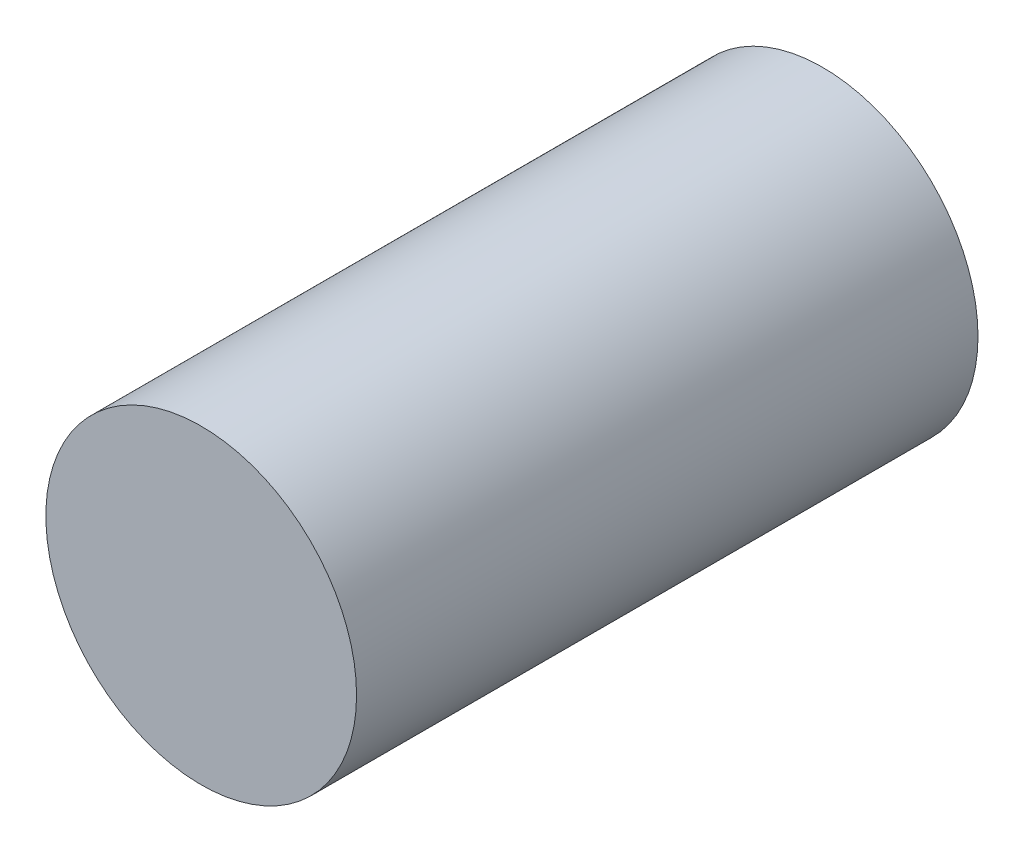
ISO-10303-21;
HEADER;
FILE_DESCRIPTION(('STEP AP214'),'2;1');
FILE_NAME('part.step','',(''),(''),'','','');
FILE_SCHEMA(('AUTOMOTIVE_DESIGN { 1 0 10303 214 1 1 1 1 }'));
ENDSEC;
DATA;
#1=APPLICATION_CONTEXT('core data for automotive mechanical design processes');
#2=APPLICATION_PROTOCOL_DEFINITION('international standard','automotive_design',2000,#1);
#3=PRODUCT_CONTEXT('',#1,'mechanical');
#4=PRODUCT('Part','Part','',(#3));
#5=PRODUCT_RELATED_PRODUCT_CATEGORY('part','',(#4));
#6=PRODUCT_DEFINITION_FORMATION('','',#4);
#7=PRODUCT_DEFINITION_CONTEXT('part definition',#1,'design');
#8=PRODUCT_DEFINITION('design','',#6,#7);
#9=PRODUCT_DEFINITION_SHAPE('','',#8);
#10=(LENGTH_UNIT() NAMED_UNIT(*) SI_UNIT(.MILLI.,.METRE.));
#11=(NAMED_UNIT(*) PLANE_ANGLE_UNIT() SI_UNIT($,.RADIAN.));
#12=(NAMED_UNIT(*) SI_UNIT($,.STERADIAN.) SOLID_ANGLE_UNIT());
#13=UNCERTAINTY_MEASURE_WITH_UNIT(LENGTH_MEASURE(1.E-05),#10,'distance_accuracy_value','');
#14=(GEOMETRIC_REPRESENTATION_CONTEXT(3) GLOBAL_UNCERTAINTY_ASSIGNED_CONTEXT((#13)) GLOBAL_UNIT_ASSIGNED_CONTEXT((#10,
#11,#12)) REPRESENTATION_CONTEXT('',''));
#15=CARTESIAN_POINT('',(0.,0.,0.));
#16=DIRECTION('',(0.,0.,1.));
#17=DIRECTION('',(1.,0.,0.));
#18=AXIS2_PLACEMENT_3D('',#15,#16,#17);
#19=CARTESIAN_POINT('',(200.,105.,-600.));
#20=DIRECTION('',(0.,0.,1.));
#21=DIRECTION('',(1.,0.,0.));
#22=AXIS2_PLACEMENT_3D('',#19,#20,#21);
#23=CYLINDRICAL_SURFACE('',#22,50.);
#24=CARTESIAN_POINT('',(200.,105.,-600.));
#25=DIRECTION('',(0.,0.,1.));
#26=DIRECTION('',(1.,0.,0.));
#27=AXIS2_PLACEMENT_3D('',#24,#25,#26);
#28=CIRCLE('',#27,50.);
#29=CARTESIAN_POINT('',(250.,105.,-600.));
#30=VERTEX_POINT('',#29);
#31=EDGE_CURVE('E10',#30,#30,#28,.T.);
#32=ORIENTED_EDGE('',*,*,#31,.T.);
#33=EDGE_LOOP('',(#32));
#34=FACE_BOUND('',#33,.T.);
#35=CARTESIAN_POINT('',(200.,105.,-400.));
#36=DIRECTION('',(0.,0.,1.));
#37=DIRECTION('',(1.,0.,0.));
#38=AXIS2_PLACEMENT_3D('',#35,#36,#37);
#39=CIRCLE('',#38,50.);
#40=CARTESIAN_POINT('',(250.,105.,-400.));
#41=VERTEX_POINT('',#40);
#42=EDGE_CURVE('E40',#41,#41,#39,.T.);
#43=ORIENTED_EDGE('',*,*,#42,.F.);
#44=EDGE_LOOP('',(#43));
#45=FACE_BOUND('',#44,.T.);
#46=ADVANCED_FACE('F37',(#34,#45),#23,.T.);
#47=CARTESIAN_POINT('',(200.,105.,-600.));
#48=DIRECTION('',(0.,0.,1.));
#49=DIRECTION('',(1.,0.,0.));
#50=AXIS2_PLACEMENT_3D('',#47,#48,#49);
#51=PLANE('',#50);
#52=ORIENTED_EDGE('',*,*,#31,.F.);
#53=EDGE_LOOP('',(#52));
#54=FACE_BOUND('',#53,.T.);
#55=ADVANCED_FACE('F52',(#54),#51,.F.);
#56=CARTESIAN_POINT('',(200.,105.,-400.));
#57=DIRECTION('',(0.,0.,1.));
#58=DIRECTION('',(1.,0.,0.));
#59=AXIS2_PLACEMENT_3D('',#56,#57,#58);
#60=PLANE('',#59);
#61=ORIENTED_EDGE('',*,*,#42,.T.);
#62=EDGE_LOOP('',(#61));
#63=FACE_BOUND('',#62,.T.);
#64=ADVANCED_FACE('F49',(#63),#60,.T.);
#65=CLOSED_SHELL('',(#46,#55,#64));
#66=MANIFOLD_SOLID_BREP('B2',#65);
#67=ADVANCED_BREP_SHAPE_REPRESENTATION('',(#18,#66),#14);
#68=SHAPE_DEFINITION_REPRESENTATION(#9,#67);
ENDSEC;
END-ISO-10303-21;
